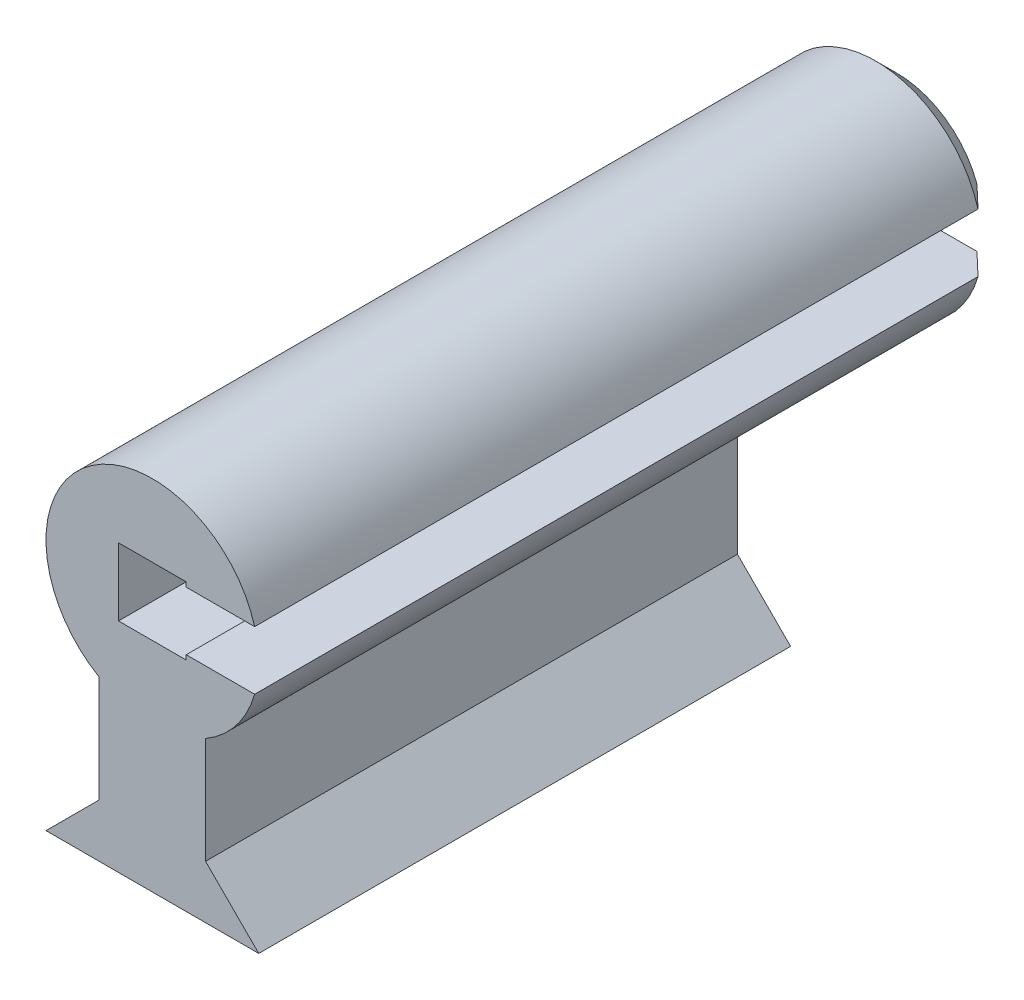
ISO-10303-21;
HEADER;
FILE_DESCRIPTION(('STEP AP214'),'2;1');
FILE_NAME('part.step','',(''),(''),'','','');
FILE_SCHEMA(('AUTOMOTIVE_DESIGN { 1 0 10303 214 1 1 1 1 }'));
ENDSEC;
DATA;
#1=APPLICATION_CONTEXT('core data for automotive mechanical design processes');
#2=APPLICATION_PROTOCOL_DEFINITION('international standard','automotive_design',2000,#1);
#3=PRODUCT_CONTEXT('',#1,'mechanical');
#4=PRODUCT('Part','Part','',(#3));
#5=PRODUCT_RELATED_PRODUCT_CATEGORY('part','',(#4));
#6=PRODUCT_DEFINITION_FORMATION('','',#4);
#7=PRODUCT_DEFINITION_CONTEXT('part definition',#1,'design');
#8=PRODUCT_DEFINITION('design','',#6,#7);
#9=PRODUCT_DEFINITION_SHAPE('','',#8);
#10=(LENGTH_UNIT() NAMED_UNIT(*) SI_UNIT(.MILLI.,.METRE.));
#11=(NAMED_UNIT(*) PLANE_ANGLE_UNIT() SI_UNIT($,.RADIAN.));
#12=(NAMED_UNIT(*) SI_UNIT($,.STERADIAN.) SOLID_ANGLE_UNIT());
#13=UNCERTAINTY_MEASURE_WITH_UNIT(LENGTH_MEASURE(1.E-05),#10,'distance_accuracy_value','');
#14=(GEOMETRIC_REPRESENTATION_CONTEXT(3) GLOBAL_UNCERTAINTY_ASSIGNED_CONTEXT((#13)) GLOBAL_UNIT_ASSIGNED_CONTEXT((#10,
#11,#12)) REPRESENTATION_CONTEXT('',''));
#15=CARTESIAN_POINT('',(0.,0.,0.));
#16=DIRECTION('',(0.,0.,1.));
#17=DIRECTION('',(1.,0.,0.));
#18=AXIS2_PLACEMENT_3D('',#15,#16,#17);
#19=CARTESIAN_POINT('',(9.61444226151471,2.75,-10.));
#20=DIRECTION('',(0.,-1.,0.));
#21=DIRECTION('',(1.,0.,0.));
#22=AXIS2_PLACEMENT_3D('',#19,#20,#21);
#23=PLANE('',#22);
#24=DIRECTION('',(1.,0.,0.));
#25=VECTOR('',#24,1.);
#26=CARTESIAN_POINT('',(9.61444226151471,2.75,-10.));
#27=LINE('',#26,#25);
#28=CARTESIAN_POINT('',(3.18198051533946,2.75,-10.));
#29=VERTEX_POINT('',#28);
#30=CARTESIAN_POINT('',(7.51248960065837,2.75,-10.));
#31=VERTEX_POINT('',#30);
#32=EDGE_CURVE('E230',#29,#31,#27,.T.);
#33=ORIENTED_EDGE('',*,*,#32,.T.);
#34=CARTESIAN_POINT('',(7.51248960065837,2.75,-10.));
#35=CARTESIAN_POINT('',(7.68874071364828,2.75,-9.83448027353542));
#36=CARTESIAN_POINT('',(7.86465726267719,2.75,-9.66860510701889));
#37=CARTESIAN_POINT('',(8.21591736822778,2.75,-9.33625204412002));
#38=CARTESIAN_POINT('',(8.39126092959036,2.75,-9.16977415285501));
#39=CARTESIAN_POINT('',(8.74147372169613,2.75,-8.83632141727329));
#40=CARTESIAN_POINT('',(8.91634295367358,2.75,-8.66934657425211));
#41=CARTESIAN_POINT('',(9.26567814975333,2.75,-8.33497256401074));
#42=CARTESIAN_POINT('',(9.44014411043721,2.75,-8.16757339321868));
#43=CARTESIAN_POINT('',(9.61444226151471,2.75,-8.00000000000001));
#44=B_SPLINE_CURVE_WITH_KNOTS('',3,(#34,#35,#36,#37,#38,#39,#40,#41,#42,#43),.UNSPECIFIED.,.F.,
.F.,(4,2,2,2,4),(0.,0.725361451781003,1.45071675939216,2.176070177724,2.90142972232475),.UNSPECIFIED.);
#45=CARTESIAN_POINT('',(9.61444226151471,2.75,-8.00000000000001));
#46=VERTEX_POINT('',#45);
#47=EDGE_CURVE('E11',#31,#46,#44,.T.);
#48=ORIENTED_EDGE('',*,*,#47,.T.);
#49=DIRECTION('',(0.,0.,1.));
#50=VECTOR('',#49,1.);
#51=CARTESIAN_POINT('',(9.61444226151471,2.75,-10.));
#52=LINE('',#51,#50);
#53=CARTESIAN_POINT('',(9.61444226151471,2.75,60.));
#54=VERTEX_POINT('',#53);
#55=EDGE_CURVE('E249',#46,#54,#52,.T.);
#56=ORIENTED_EDGE('',*,*,#55,.T.);
#57=DIRECTION('',(1.,0.,0.));
#58=VECTOR('',#57,1.);
#59=CARTESIAN_POINT('',(9.61444226151471,2.75,60.));
#60=LINE('',#59,#58);
#61=CARTESIAN_POINT('',(3.18198051533946,2.75,60.));
#62=VERTEX_POINT('',#61);
#63=EDGE_CURVE('E199',#62,#54,#60,.T.);
#64=ORIENTED_EDGE('',*,*,#63,.F.);
#65=DIRECTION('',(0.,0.,1.));
#66=VECTOR('',#65,1.);
#67=CARTESIAN_POINT('',(3.18198051533946,2.75,-10.));
#68=LINE('',#67,#66);
#69=EDGE_CURVE('E250',#29,#62,#68,.T.);
#70=ORIENTED_EDGE('',*,*,#69,.F.);
#71=EDGE_LOOP('',(#33,#48,#56,#64,#70));
#72=FACE_BOUND('',#71,.T.);
#73=ADVANCED_FACE('F35',(#72),#23,.T.);
#74=CARTESIAN_POINT('',(3.18198051533946,2.75,-10.));
#75=DIRECTION('',(-1.,0.,0.));
#76=DIRECTION('',(0.,0.,1.));
#77=AXIS2_PLACEMENT_3D('',#74,#75,#76);
#78=PLANE('',#77);
#79=ORIENTED_EDGE('',*,*,#69,.T.);
#80=DIRECTION('',(0.,-1.,0.));
#81=VECTOR('',#80,1.);
#82=CARTESIAN_POINT('',(3.18198051533946,2.75,60.));
#83=LINE('',#82,#81);
#84=CARTESIAN_POINT('',(3.18198051533946,3.18198051533946,60.));
#85=VERTEX_POINT('',#84);
#86=EDGE_CURVE('E227',#85,#62,#83,.T.);
#87=ORIENTED_EDGE('',*,*,#86,.F.);
#88=DIRECTION('',(0.,0.,1.));
#89=VECTOR('',#88,1.);
#90=CARTESIAN_POINT('',(3.18198051533946,3.18198051533946,-10.));
#91=LINE('',#90,#89);
#92=CARTESIAN_POINT('',(3.18198051533946,3.18198051533946,-10.));
#93=VERTEX_POINT('',#92);
#94=EDGE_CURVE('E253',#93,#85,#91,.T.);
#95=ORIENTED_EDGE('',*,*,#94,.F.);
#96=DIRECTION('',(0.,-1.,0.));
#97=VECTOR('',#96,1.);
#98=CARTESIAN_POINT('',(3.18198051533946,2.75,-10.));
#99=LINE('',#98,#97);
#100=EDGE_CURVE('E246',#93,#29,#99,.T.);
#101=ORIENTED_EDGE('',*,*,#100,.T.);
#102=EDGE_LOOP('',(#79,#87,#95,#101));
#103=FACE_BOUND('',#102,.T.);
#104=ADVANCED_FACE('F284',(#103),#78,.T.);
#105=CARTESIAN_POINT('',(-3.18198051533946,3.18198051533946,-10.));
#106=DIRECTION('',(0.,-1.,0.));
#107=DIRECTION('',(1.,0.,0.));
#108=AXIS2_PLACEMENT_3D('',#105,#106,#107);
#109=PLANE('',#108);
#110=ORIENTED_EDGE('',*,*,#94,.T.);
#111=DIRECTION('',(1.,0.,0.));
#112=VECTOR('',#111,1.);
#113=CARTESIAN_POINT('',(-3.18198051533946,3.18198051533946,60.));
#114=LINE('',#113,#112);
#115=CARTESIAN_POINT('',(-3.18198051533946,3.18198051533946,60.));
#116=VERTEX_POINT('',#115);
#117=EDGE_CURVE('E224',#116,#85,#114,.T.);
#118=ORIENTED_EDGE('',*,*,#117,.F.);
#119=DIRECTION('',(0.,0.,1.));
#120=VECTOR('',#119,1.);
#121=CARTESIAN_POINT('',(-3.18198051533946,3.18198051533946,-10.));
#122=LINE('',#121,#120);
#123=CARTESIAN_POINT('',(-3.18198051533946,3.18198051533946,-10.));
#124=VERTEX_POINT('',#123);
#125=EDGE_CURVE('E255',#124,#116,#122,.T.);
#126=ORIENTED_EDGE('',*,*,#125,.F.);
#127=DIRECTION('',(1.,0.,0.));
#128=VECTOR('',#127,1.);
#129=CARTESIAN_POINT('',(-3.18198051533946,3.18198051533946,-10.));
#130=LINE('',#129,#128);
#131=EDGE_CURVE('E243',#124,#93,#130,.T.);
#132=ORIENTED_EDGE('',*,*,#131,.T.);
#133=EDGE_LOOP('',(#110,#118,#126,#132));
#134=FACE_BOUND('',#133,.T.);
#135=ADVANCED_FACE('F289',(#134),#109,.T.);
#136=CARTESIAN_POINT('',(-3.18198051533946,-3.18198051533946,-10.));
#137=DIRECTION('',(1.,0.,0.));
#138=DIRECTION('',(0.,0.,-1.));
#139=AXIS2_PLACEMENT_3D('',#136,#137,#138);
#140=PLANE('',#139);
#141=ORIENTED_EDGE('',*,*,#125,.T.);
#142=DIRECTION('',(0.,1.,0.));
#143=VECTOR('',#142,1.);
#144=CARTESIAN_POINT('',(-3.18198051533946,-3.18198051533946,60.));
#145=LINE('',#144,#143);
#146=CARTESIAN_POINT('',(-3.18198051533946,-3.18198051533946,60.));
#147=VERTEX_POINT('',#146);
#148=EDGE_CURVE('E221',#147,#116,#145,.T.);
#149=ORIENTED_EDGE('',*,*,#148,.F.);
#150=DIRECTION('',(0.,0.,1.));
#151=VECTOR('',#150,1.);
#152=CARTESIAN_POINT('',(-3.18198051533946,-3.18198051533946,-10.));
#153=LINE('',#152,#151);
#154=CARTESIAN_POINT('',(-3.18198051533946,-3.18198051533946,-10.));
#155=VERTEX_POINT('',#154);
#156=EDGE_CURVE('E257',#155,#147,#153,.T.);
#157=ORIENTED_EDGE('',*,*,#156,.F.);
#158=DIRECTION('',(0.,1.,0.));
#159=VECTOR('',#158,1.);
#160=CARTESIAN_POINT('',(-3.18198051533946,-3.18198051533946,-10.));
#161=LINE('',#160,#159);
#162=EDGE_CURVE('E240',#155,#124,#161,.T.);
#163=ORIENTED_EDGE('',*,*,#162,.T.);
#164=EDGE_LOOP('',(#141,#149,#157,#163));
#165=FACE_BOUND('',#164,.T.);
#166=ADVANCED_FACE('F312',(#165),#140,.T.);
#167=CARTESIAN_POINT('',(-3.18198051533946,-3.18198051533946,-10.));
#168=DIRECTION('',(0.,1.,0.));
#169=DIRECTION('',(-1.,0.,0.));
#170=AXIS2_PLACEMENT_3D('',#167,#168,#169);
#171=PLANE('',#170);
#172=ORIENTED_EDGE('',*,*,#156,.T.);
#173=DIRECTION('',(-1.,0.,0.));
#174=VECTOR('',#173,1.);
#175=CARTESIAN_POINT('',(-3.18198051533946,-3.18198051533946,60.));
#176=LINE('',#175,#174);
#177=CARTESIAN_POINT('',(3.18198051533946,-3.18198051533946,60.));
#178=VERTEX_POINT('',#177);
#179=EDGE_CURVE('E218',#178,#147,#176,.T.);
#180=ORIENTED_EDGE('',*,*,#179,.F.);
#181=DIRECTION('',(0.,0.,1.));
#182=VECTOR('',#181,1.);
#183=CARTESIAN_POINT('',(3.18198051533946,-3.18198051533946,-10.));
#184=LINE('',#183,#182);
#185=CARTESIAN_POINT('',(3.18198051533946,-3.18198051533946,-10.));
#186=VERTEX_POINT('',#185);
#187=EDGE_CURVE('E259',#186,#178,#184,.T.);
#188=ORIENTED_EDGE('',*,*,#187,.F.);
#189=DIRECTION('',(-1.,0.,0.));
#190=VECTOR('',#189,1.);
#191=CARTESIAN_POINT('',(-3.18198051533946,-3.18198051533946,-10.));
#192=LINE('',#191,#190);
#193=EDGE_CURVE('E237',#186,#155,#192,.T.);
#194=ORIENTED_EDGE('',*,*,#193,.T.);
#195=EDGE_LOOP('',(#172,#180,#188,#194));
#196=FACE_BOUND('',#195,.T.);
#197=ADVANCED_FACE('F308',(#196),#171,.T.);
#198=CARTESIAN_POINT('',(3.18198051533946,-3.18198051533946,-10.));
#199=DIRECTION('',(-1.,0.,0.));
#200=DIRECTION('',(0.,0.,1.));
#201=AXIS2_PLACEMENT_3D('',#198,#199,#200);
#202=PLANE('',#201);
#203=ORIENTED_EDGE('',*,*,#187,.T.);
#204=DIRECTION('',(0.,-1.,0.));
#205=VECTOR('',#204,1.);
#206=CARTESIAN_POINT('',(3.18198051533946,-3.18198051533946,60.));
#207=LINE('',#206,#205);
#208=CARTESIAN_POINT('',(3.18198051533946,-2.75,60.));
#209=VERTEX_POINT('',#208);
#210=EDGE_CURVE('E215',#209,#178,#207,.T.);
#211=ORIENTED_EDGE('',*,*,#210,.F.);
#212=DIRECTION('',(0.,0.,1.));
#213=VECTOR('',#212,1.);
#214=CARTESIAN_POINT('',(3.18198051533946,-2.75,-10.));
#215=LINE('',#214,#213);
#216=CARTESIAN_POINT('',(3.18198051533946,-2.75,-10.));
#217=VERTEX_POINT('',#216);
#218=EDGE_CURVE('E261',#217,#209,#215,.T.);
#219=ORIENTED_EDGE('',*,*,#218,.F.);
#220=DIRECTION('',(0.,-1.,0.));
#221=VECTOR('',#220,1.);
#222=CARTESIAN_POINT('',(3.18198051533946,-3.18198051533946,-10.));
#223=LINE('',#222,#221);
#224=EDGE_CURVE('E234',#217,#186,#223,.T.);
#225=ORIENTED_EDGE('',*,*,#224,.T.);
#226=EDGE_LOOP('',(#203,#211,#219,#225));
#227=FACE_BOUND('',#226,.T.);
#228=ADVANCED_FACE('F278',(#227),#202,.T.);
#229=CARTESIAN_POINT('',(9.61444226151471,-2.75,-10.));
#230=DIRECTION('',(0.,1.,0.));
#231=DIRECTION('',(-1.,0.,0.));
#232=AXIS2_PLACEMENT_3D('',#229,#230,#231);
#233=PLANE('',#232);
#234=DIRECTION('',(0.,0.,1.));
#235=VECTOR('',#234,1.);
#236=CARTESIAN_POINT('',(9.61444226151471,-2.75,-10.));
#237=LINE('',#236,#235);
#238=CARTESIAN_POINT('',(9.61444226151471,-2.75,-8.00000000000001));
#239=VERTEX_POINT('',#238);
#240=CARTESIAN_POINT('',(9.61444226151471,-2.75,60.));
#241=VERTEX_POINT('',#240);
#242=EDGE_CURVE('E263',#239,#241,#237,.T.);
#243=ORIENTED_EDGE('',*,*,#242,.F.);
#244=CARTESIAN_POINT('',(9.61444226151471,-2.75,-8.00000000000001));
#245=CARTESIAN_POINT('',(9.44014411043721,-2.75,-8.16757339321868));
#246=CARTESIAN_POINT('',(9.26567814975333,-2.75,-8.33497256401074));
#247=CARTESIAN_POINT('',(8.91634295367358,-2.75,-8.66934657425211));
#248=CARTESIAN_POINT('',(8.74147372169613,-2.75,-8.8363214172733));
#249=CARTESIAN_POINT('',(8.39126092959036,-2.75,-9.16977415285501));
#250=CARTESIAN_POINT('',(8.21591736822778,-2.75,-9.33625204412003));
#251=CARTESIAN_POINT('',(7.86465726267719,-2.75,-9.6686051070189));
#252=CARTESIAN_POINT('',(7.68874071364828,-2.75,-9.83448027353543));
#253=CARTESIAN_POINT('',(7.51248960065837,-2.75,-10.));
#254=B_SPLINE_CURVE_WITH_KNOTS('',3,(#244,#245,#246,#247,#248,#249,#250,#251,#252,#253),
.UNSPECIFIED.,.F.,.F.,(4,2,2,2,4),(0.,0.725359544600752,1.45071296293259,2.17606827054375,
2.90142972232475),.UNSPECIFIED.);
#255=CARTESIAN_POINT('',(7.51248960065837,-2.75,-10.));
#256=VERTEX_POINT('',#255);
#257=EDGE_CURVE('E63',#239,#256,#254,.T.);
#258=ORIENTED_EDGE('',*,*,#257,.T.);
#259=DIRECTION('',(-1.,0.,0.));
#260=VECTOR('',#259,1.);
#261=CARTESIAN_POINT('',(9.61444226151471,-2.75,-10.));
#262=LINE('',#261,#260);
#263=EDGE_CURVE('E232',#256,#217,#262,.T.);
#264=ORIENTED_EDGE('',*,*,#263,.T.);
#265=ORIENTED_EDGE('',*,*,#218,.T.);
#266=DIRECTION('',(-1.,0.,0.));
#267=VECTOR('',#266,1.);
#268=CARTESIAN_POINT('',(9.61444226151471,-2.75,60.));
#269=LINE('',#268,#267);
#270=EDGE_CURVE('E212',#241,#209,#269,.T.);
#271=ORIENTED_EDGE('',*,*,#270,.F.);
#272=EDGE_LOOP('',(#243,#258,#264,#265,#271));
#273=FACE_BOUND('',#272,.T.);
#274=ADVANCED_FACE('F273',(#273),#233,.T.);
#275=CARTESIAN_POINT('',(0.,0.,-10.));
#276=DIRECTION('',(0.,0.,1.));
#277=DIRECTION('',(1.,0.,0.));
#278=AXIS2_PLACEMENT_3D('',#275,#276,#277);
#279=CYLINDRICAL_SURFACE('',#278,10.);
#280=ORIENTED_EDGE('',*,*,#55,.F.);
#281=CARTESIAN_POINT('',(0.,0.,-8.00000000000001));
#282=DIRECTION('',(0.,0.,1.));
#283=DIRECTION('',(1.,0.,0.));
#284=AXIS2_PLACEMENT_3D('',#281,#282,#283);
#285=CIRCLE('',#284,10.);
#286=EDGE_CURVE('E252',#46,#239,#285,.T.);
#287=ORIENTED_EDGE('',*,*,#286,.T.);
#288=ORIENTED_EDGE('',*,*,#242,.T.);
#289=CARTESIAN_POINT('',(0.,0.,60.));
#290=DIRECTION('',(0.,0.,1.));
#291=DIRECTION('',(1.,0.,0.));
#292=AXIS2_PLACEMENT_3D('',#289,#290,#291);
#293=CIRCLE('',#292,10.);
#294=CARTESIAN_POINT('',(5.,-8.66025403784439,60.));
#295=VERTEX_POINT('',#294);
#296=EDGE_CURVE('E209',#295,#241,#293,.T.);
#297=ORIENTED_EDGE('',*,*,#296,.F.);
#298=DIRECTION('',(0.,0.,1.));
#299=VECTOR('',#298,1.);
#300=CARTESIAN_POINT('',(5.,-8.66025403784439,9.99999999999999));
#301=LINE('',#300,#299);
#302=CARTESIAN_POINT('',(5.,-8.66025403784439,9.99999999999999));
#303=VERTEX_POINT('',#302);
#304=EDGE_CURVE('E175',#303,#295,#301,.T.);
#305=ORIENTED_EDGE('',*,*,#304,.F.);
#306=CARTESIAN_POINT('',(0.,0.,9.99999999999999));
#307=DIRECTION('',(0.,0.,-1.));
#308=DIRECTION('',(-1.,0.,0.));
#309=AXIS2_PLACEMENT_3D('',#306,#307,#308);
#310=CIRCLE('',#309,10.);
#311=CARTESIAN_POINT('',(-5.,-8.66025403784439,9.99999999999999));
#312=VERTEX_POINT('',#311);
#313=EDGE_CURVE('E164',#303,#312,#310,.T.);
#314=ORIENTED_EDGE('',*,*,#313,.T.);
#315=DIRECTION('',(0.,0.,1.));
#316=VECTOR('',#315,1.);
#317=CARTESIAN_POINT('',(-5.,-8.66025403784439,9.99999999999999));
#318=LINE('',#317,#316);
#319=CARTESIAN_POINT('',(-5.,-8.66025403784439,60.));
#320=VERTEX_POINT('',#319);
#321=EDGE_CURVE('E147',#312,#320,#318,.T.);
#322=ORIENTED_EDGE('',*,*,#321,.T.);
#323=EDGE_CURVE('E210',#54,#320,#293,.T.);
#324=ORIENTED_EDGE('',*,*,#323,.F.);
#325=EDGE_LOOP('',(#280,#287,#288,#297,#305,#314,#322,#324));
#326=FACE_BOUND('',#325,.T.);
#327=ADVANCED_FACE('F172',(#326),#279,.T.);
#328=CARTESIAN_POINT('',(0.,0.,-10.));
#329=DIRECTION('',(0.,0.,1.));
#330=DIRECTION('',(1.,0.,0.));
#331=AXIS2_PLACEMENT_3D('',#328,#329,#330);
#332=PLANE('',#331);
#333=ORIENTED_EDGE('',*,*,#263,.F.);
#334=CARTESIAN_POINT('',(0.,0.,-10.));
#335=DIRECTION('',(0.,0.,1.));
#336=DIRECTION('',(1.,0.,0.));
#337=AXIS2_PLACEMENT_3D('',#334,#335,#336);
#338=CIRCLE('',#337,8.00000000000001);
#339=EDGE_CURVE('E49',#256,#31,#338,.F.);
#340=ORIENTED_EDGE('',*,*,#339,.T.);
#341=ORIENTED_EDGE('',*,*,#32,.F.);
#342=ORIENTED_EDGE('',*,*,#100,.F.);
#343=ORIENTED_EDGE('',*,*,#131,.F.);
#344=ORIENTED_EDGE('',*,*,#162,.F.);
#345=ORIENTED_EDGE('',*,*,#193,.F.);
#346=ORIENTED_EDGE('',*,*,#224,.F.);
#347=EDGE_LOOP('',(#333,#340,#341,#342,#343,#344,#345,#346));
#348=FACE_BOUND('',#347,.T.);
#349=ADVANCED_FACE('F281',(#348),#332,.F.);
#350=CARTESIAN_POINT('',(0.,0.,60.));
#351=DIRECTION('',(0.,0.,1.));
#352=DIRECTION('',(1.,0.,0.));
#353=AXIS2_PLACEMENT_3D('',#350,#351,#352);
#354=PLANE('',#353);
#355=ORIENTED_EDGE('',*,*,#63,.T.);
#356=ORIENTED_EDGE('',*,*,#323,.T.);
#357=DIRECTION('',(0.,-1.,0.));
#358=VECTOR('',#357,1.);
#359=CARTESIAN_POINT('',(-5.,-8.66025403784439,60.));
#360=LINE('',#359,#358);
#361=CARTESIAN_POINT('',(-5.,-18.6602540378444,60.));
#362=VERTEX_POINT('',#361);
#363=EDGE_CURVE('E152',#320,#362,#360,.T.);
#364=ORIENTED_EDGE('',*,*,#363,.T.);
#365=DIRECTION('',(-0.707106781186546,-0.707106781186549,0.));
#366=VECTOR('',#365,1.);
#367=CARTESIAN_POINT('',(-5.,-18.6602540378444,60.));
#368=LINE('',#367,#366);
#369=CARTESIAN_POINT('',(-9.99999999999998,-23.6602540378444,60.));
#370=VERTEX_POINT('',#369);
#371=EDGE_CURVE('E190',#362,#370,#368,.T.);
#372=ORIENTED_EDGE('',*,*,#371,.T.);
#373=DIRECTION('',(1.,0.,0.));
#374=VECTOR('',#373,1.);
#375=CARTESIAN_POINT('',(9.99999999999998,-23.6602540378444,60.));
#376=LINE('',#375,#374);
#377=CARTESIAN_POINT('',(9.99999999999998,-23.6602540378444,60.));
#378=VERTEX_POINT('',#377);
#379=EDGE_CURVE('E193',#370,#378,#376,.T.);
#380=ORIENTED_EDGE('',*,*,#379,.T.);
#381=DIRECTION('',(-0.707106781186546,0.707106781186549,0.));
#382=VECTOR('',#381,1.);
#383=CARTESIAN_POINT('',(5.,-18.6602540378444,60.));
#384=LINE('',#383,#382);
#385=CARTESIAN_POINT('',(5.,-18.6602540378444,60.));
#386=VERTEX_POINT('',#385);
#387=EDGE_CURVE('E178',#378,#386,#384,.T.);
#388=ORIENTED_EDGE('',*,*,#387,.T.);
#389=DIRECTION('',(0.,1.,0.));
#390=VECTOR('',#389,1.);
#391=CARTESIAN_POINT('',(5.,-8.66025403784439,60.));
#392=LINE('',#391,#390);
#393=EDGE_CURVE('E176',#386,#295,#392,.T.);
#394=ORIENTED_EDGE('',*,*,#393,.T.);
#395=ORIENTED_EDGE('',*,*,#296,.T.);
#396=ORIENTED_EDGE('',*,*,#270,.T.);
#397=ORIENTED_EDGE('',*,*,#210,.T.);
#398=ORIENTED_EDGE('',*,*,#179,.T.);
#399=ORIENTED_EDGE('',*,*,#148,.T.);
#400=ORIENTED_EDGE('',*,*,#117,.T.);
#401=ORIENTED_EDGE('',*,*,#86,.T.);
#402=EDGE_LOOP('',(#355,#356,#364,#372,#380,#388,#394,#395,#396,#397,#398,#399,#400,#401));
#403=FACE_BOUND('',#402,.T.);
#404=ADVANCED_FACE('F302',(#403),#354,.T.);
#405=CARTESIAN_POINT('',(5.,-8.66025403784439,9.99999999999999));
#406=DIRECTION('',(1.,0.,0.));
#407=DIRECTION('',(0.,1.,0.));
#408=AXIS2_PLACEMENT_3D('',#405,#406,#407);
#409=PLANE('',#408);
#410=ORIENTED_EDGE('',*,*,#393,.F.);
#411=DIRECTION('',(0.,0.,1.));
#412=VECTOR('',#411,1.);
#413=CARTESIAN_POINT('',(5.,-18.6602540378444,9.99999999999999));
#414=LINE('',#413,#412);
#415=CARTESIAN_POINT('',(5.,-18.6602540378444,9.99999999999999));
#416=VERTEX_POINT('',#415);
#417=EDGE_CURVE('E200',#416,#386,#414,.T.);
#418=ORIENTED_EDGE('',*,*,#417,.F.);
#419=DIRECTION('',(0.,1.,0.));
#420=VECTOR('',#419,1.);
#421=CARTESIAN_POINT('',(5.,-8.66025403784439,9.99999999999999));
#422=LINE('',#421,#420);
#423=EDGE_CURVE('E158',#416,#303,#422,.T.);
#424=ORIENTED_EDGE('',*,*,#423,.T.);
#425=ORIENTED_EDGE('',*,*,#304,.T.);
#426=EDGE_LOOP('',(#410,#418,#424,#425));
#427=FACE_BOUND('',#426,.T.);
#428=ADVANCED_FACE('F329',(#427),#409,.T.);
#429=CARTESIAN_POINT('',(5.,-18.6602540378444,9.99999999999999));
#430=DIRECTION('',(0.707106781186549,0.707106781186546,0.));
#431=DIRECTION('',(-0.707106781186546,0.707106781186549,0.));
#432=AXIS2_PLACEMENT_3D('',#429,#430,#431);
#433=PLANE('',#432);
#434=ORIENTED_EDGE('',*,*,#387,.F.);
#435=DIRECTION('',(0.,0.,1.));
#436=VECTOR('',#435,1.);
#437=CARTESIAN_POINT('',(9.99999999999998,-23.6602540378444,9.99999999999999));
#438=LINE('',#437,#436);
#439=CARTESIAN_POINT('',(9.99999999999998,-23.6602540378444,9.99999999999999));
#440=VERTEX_POINT('',#439);
#441=EDGE_CURVE('E202',#440,#378,#438,.T.);
#442=ORIENTED_EDGE('',*,*,#441,.F.);
#443=DIRECTION('',(-0.707106781186546,0.707106781186549,0.));
#444=VECTOR('',#443,1.);
#445=CARTESIAN_POINT('',(5.,-18.6602540378444,9.99999999999999));
#446=LINE('',#445,#444);
#447=EDGE_CURVE('E185',#440,#416,#446,.T.);
#448=ORIENTED_EDGE('',*,*,#447,.T.);
#449=ORIENTED_EDGE('',*,*,#417,.T.);
#450=EDGE_LOOP('',(#434,#442,#448,#449));
#451=FACE_BOUND('',#450,.T.);
#452=ADVANCED_FACE('F326',(#451),#433,.T.);
#453=CARTESIAN_POINT('',(9.99999999999998,-23.6602540378444,9.99999999999999));
#454=DIRECTION('',(0.,-1.,0.));
#455=DIRECTION('',(0.,0.,-1.));
#456=AXIS2_PLACEMENT_3D('',#453,#454,#455);
#457=PLANE('',#456);
#458=ORIENTED_EDGE('',*,*,#379,.F.);
#459=DIRECTION('',(0.,0.,1.));
#460=VECTOR('',#459,1.);
#461=CARTESIAN_POINT('',(-9.99999999999998,-23.6602540378444,9.99999999999999));
#462=LINE('',#461,#460);
#463=CARTESIAN_POINT('',(-9.99999999999998,-23.6602540378444,9.99999999999999));
#464=VERTEX_POINT('',#463);
#465=EDGE_CURVE('E204',#464,#370,#462,.T.);
#466=ORIENTED_EDGE('',*,*,#465,.F.);
#467=DIRECTION('',(1.,0.,0.));
#468=VECTOR('',#467,1.);
#469=CARTESIAN_POINT('',(9.99999999999998,-23.6602540378444,9.99999999999999));
#470=LINE('',#469,#468);
#471=EDGE_CURVE('E182',#464,#440,#470,.T.);
#472=ORIENTED_EDGE('',*,*,#471,.T.);
#473=ORIENTED_EDGE('',*,*,#441,.T.);
#474=EDGE_LOOP('',(#458,#466,#472,#473));
#475=FACE_BOUND('',#474,.T.);
#476=ADVANCED_FACE('F322',(#475),#457,.T.);
#477=CARTESIAN_POINT('',(-5.,-18.6602540378444,9.99999999999999));
#478=DIRECTION('',(-0.707106781186549,0.707106781186546,0.));
#479=DIRECTION('',(-0.707106781186546,-0.707106781186549,0.));
#480=AXIS2_PLACEMENT_3D('',#477,#478,#479);
#481=PLANE('',#480);
#482=ORIENTED_EDGE('',*,*,#371,.F.);
#483=DIRECTION('',(0.,0.,1.));
#484=VECTOR('',#483,1.);
#485=CARTESIAN_POINT('',(-5.,-18.6602540378444,9.99999999999999));
#486=LINE('',#485,#484);
#487=CARTESIAN_POINT('',(-5.,-18.6602540378444,9.99999999999999));
#488=VERTEX_POINT('',#487);
#489=EDGE_CURVE('E157',#488,#362,#486,.T.);
#490=ORIENTED_EDGE('',*,*,#489,.F.);
#491=DIRECTION('',(-0.707106781186546,-0.707106781186549,0.));
#492=VECTOR('',#491,1.);
#493=CARTESIAN_POINT('',(-5.,-18.6602540378444,9.99999999999999));
#494=LINE('',#493,#492);
#495=EDGE_CURVE('E168',#488,#464,#494,.T.);
#496=ORIENTED_EDGE('',*,*,#495,.T.);
#497=ORIENTED_EDGE('',*,*,#465,.T.);
#498=EDGE_LOOP('',(#482,#490,#496,#497));
#499=FACE_BOUND('',#498,.T.);
#500=ADVANCED_FACE('F320',(#499),#481,.T.);
#501=CARTESIAN_POINT('',(-5.,-8.66025403784439,9.99999999999999));
#502=DIRECTION('',(-1.,0.,0.));
#503=DIRECTION('',(0.,0.,1.));
#504=AXIS2_PLACEMENT_3D('',#501,#502,#503);
#505=PLANE('',#504);
#506=ORIENTED_EDGE('',*,*,#363,.F.);
#507=ORIENTED_EDGE('',*,*,#321,.F.);
#508=DIRECTION('',(0.,-1.,0.));
#509=VECTOR('',#508,1.);
#510=CARTESIAN_POINT('',(-5.,-8.66025403784439,9.99999999999999));
#511=LINE('',#510,#509);
#512=EDGE_CURVE('E150',#312,#488,#511,.T.);
#513=ORIENTED_EDGE('',*,*,#512,.T.);
#514=ORIENTED_EDGE('',*,*,#489,.T.);
#515=EDGE_LOOP('',(#506,#507,#513,#514));
#516=FACE_BOUND('',#515,.T.);
#517=ADVANCED_FACE('F149',(#516),#505,.T.);
#518=CARTESIAN_POINT('',(0.,0.,9.99999999999999));
#519=DIRECTION('',(0.,0.,-1.));
#520=DIRECTION('',(-1.,0.,0.));
#521=AXIS2_PLACEMENT_3D('',#518,#519,#520);
#522=PLANE('',#521);
#523=ORIENTED_EDGE('',*,*,#313,.F.);
#524=ORIENTED_EDGE('',*,*,#423,.F.);
#525=ORIENTED_EDGE('',*,*,#447,.F.);
#526=ORIENTED_EDGE('',*,*,#471,.F.);
#527=ORIENTED_EDGE('',*,*,#495,.F.);
#528=ORIENTED_EDGE('',*,*,#512,.F.);
#529=EDGE_LOOP('',(#523,#524,#525,#526,#527,#528));
#530=FACE_BOUND('',#529,.T.);
#531=ADVANCED_FACE('F162',(#530),#522,.T.);
#532=CARTESIAN_POINT('',(0.,0.,-8.00000000000001));
#533=DIRECTION('',(0.,0.,1.));
#534=DIRECTION('',(1.,0.,0.));
#535=AXIS2_PLACEMENT_3D('',#532,#533,#534);
#536=CONICAL_SURFACE('',#535,10.,0.78539816339745);
#537=ORIENTED_EDGE('',*,*,#47,.F.);
#538=ORIENTED_EDGE('',*,*,#339,.F.);
#539=ORIENTED_EDGE('',*,*,#257,.F.);
#540=ORIENTED_EDGE('',*,*,#286,.F.);
#541=EDGE_LOOP('',(#537,#538,#539,#540));
#542=FACE_BOUND('',#541,.T.);
#543=ADVANCED_FACE('F38',(#542),#536,.T.);
#544=CLOSED_SHELL('',(#73,#104,#135,#166,#197,#228,#274,#327,#349,#404,#428,#452,#476,#500,#517,
#531,#543));
#545=MANIFOLD_SOLID_BREP('B2',#544);
#546=ADVANCED_BREP_SHAPE_REPRESENTATION('',(#18,#545),#14);
#547=SHAPE_DEFINITION_REPRESENTATION(#9,#546);
ENDSEC;
END-ISO-10303-21;
